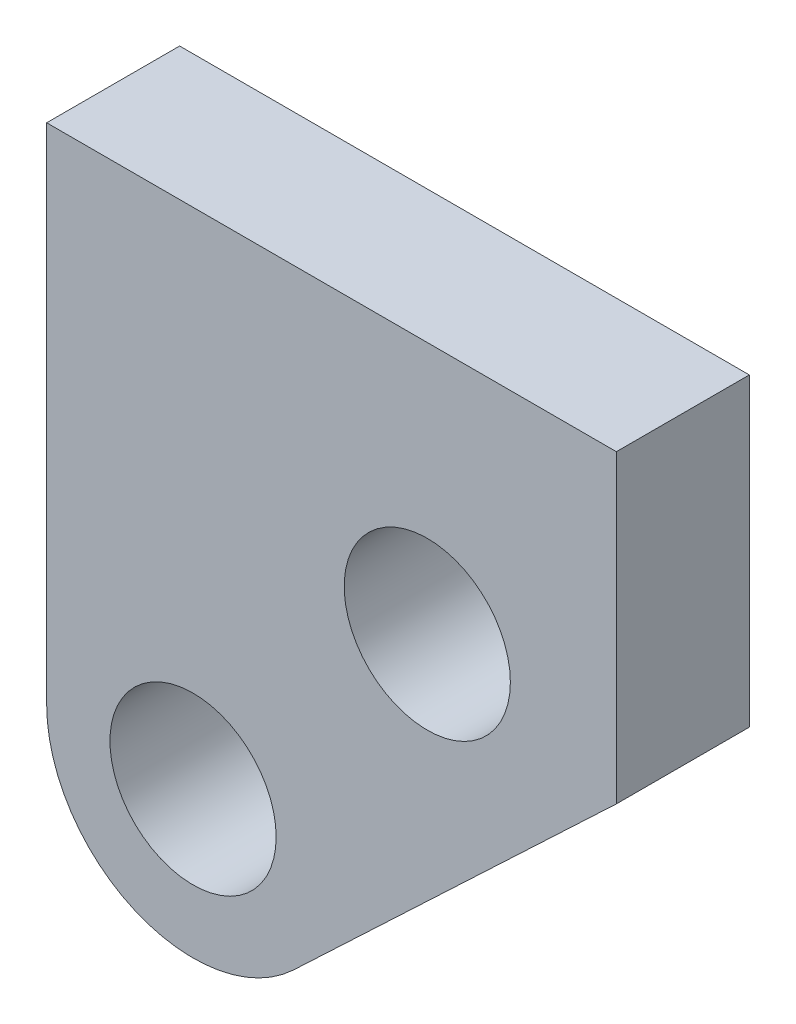
ISO-10303-21;
HEADER;
FILE_DESCRIPTION(('STEP AP214'),'2;1');
FILE_NAME('part.step','',(''),(''),'','','');
FILE_SCHEMA(('AUTOMOTIVE_DESIGN { 1 0 10303 214 1 1 1 1 }'));
ENDSEC;
DATA;
#1=APPLICATION_CONTEXT('core data for automotive mechanical design processes');
#2=APPLICATION_PROTOCOL_DEFINITION('international standard','automotive_design',2000,#1);
#3=PRODUCT_CONTEXT('',#1,'mechanical');
#4=PRODUCT('Part','Part','',(#3));
#5=PRODUCT_RELATED_PRODUCT_CATEGORY('part','',(#4));
#6=PRODUCT_DEFINITION_FORMATION('','',#4);
#7=PRODUCT_DEFINITION_CONTEXT('part definition',#1,'design');
#8=PRODUCT_DEFINITION('design','',#6,#7);
#9=PRODUCT_DEFINITION_SHAPE('','',#8);
#10=(LENGTH_UNIT() NAMED_UNIT(*) SI_UNIT(.MILLI.,.METRE.));
#11=(NAMED_UNIT(*) PLANE_ANGLE_UNIT() SI_UNIT($,.RADIAN.));
#12=(NAMED_UNIT(*) SI_UNIT($,.STERADIAN.) SOLID_ANGLE_UNIT());
#13=UNCERTAINTY_MEASURE_WITH_UNIT(LENGTH_MEASURE(1.E-05),#10,'distance_accuracy_value','');
#14=(GEOMETRIC_REPRESENTATION_CONTEXT(3) GLOBAL_UNCERTAINTY_ASSIGNED_CONTEXT((#13)) GLOBAL_UNIT_ASSIGNED_CONTEXT((#10,
#11,#12)) REPRESENTATION_CONTEXT('',''));
#15=CARTESIAN_POINT('',(0.,0.,0.));
#16=DIRECTION('',(0.,0.,1.));
#17=DIRECTION('',(1.,0.,0.));
#18=AXIS2_PLACEMENT_3D('',#15,#16,#17);
#19=CARTESIAN_POINT('',(54.0594805580869,22.7056662648686,-10.));
#20=DIRECTION('',(1.,0.,0.));
#21=DIRECTION('',(0.,0.,-1.));
#22=AXIS2_PLACEMENT_3D('',#19,#20,#21);
#23=PLANE('',#22);
#24=DIRECTION('',(0.,1.,0.));
#25=VECTOR('',#24,1.);
#26=CARTESIAN_POINT('',(54.0594805580869,22.7056662648686,0.));
#27=LINE('',#26,#25);
#28=CARTESIAN_POINT('',(54.0594805580869,-0.23891661839081,0.));
#29=VERTEX_POINT('',#28);
#30=CARTESIAN_POINT('',(54.0594805580869,22.7056662648686,0.));
#31=VERTEX_POINT('',#30);
#32=EDGE_CURVE('E114',#29,#31,#27,.T.);
#33=ORIENTED_EDGE('',*,*,#32,.F.);
#34=DIRECTION('',(0.,0.,1.));
#35=VECTOR('',#34,1.);
#36=CARTESIAN_POINT('',(54.0594805580869,-0.23891661839081,-10.));
#37=LINE('',#36,#35);
#38=CARTESIAN_POINT('',(54.0594805580869,-0.23891661839081,-10.));
#39=VERTEX_POINT('',#38);
#40=EDGE_CURVE('E11',#39,#29,#37,.T.);
#41=ORIENTED_EDGE('',*,*,#40,.F.);
#42=DIRECTION('',(0.,1.,0.));
#43=VECTOR('',#42,1.);
#44=CARTESIAN_POINT('',(54.0594805580869,22.7056662648686,-10.));
#45=LINE('',#44,#43);
#46=CARTESIAN_POINT('',(54.0594805580869,22.7056662648686,-10.));
#47=VERTEX_POINT('',#46);
#48=EDGE_CURVE('E109',#39,#47,#45,.T.);
#49=ORIENTED_EDGE('',*,*,#48,.T.);
#50=DIRECTION('',(0.,0.,1.));
#51=VECTOR('',#50,1.);
#52=CARTESIAN_POINT('',(54.0594805580869,22.7056662648686,-10.));
#53=LINE('',#52,#51);
#54=EDGE_CURVE('E40',#47,#31,#53,.T.);
#55=ORIENTED_EDGE('',*,*,#54,.T.);
#56=EDGE_LOOP('',(#33,#41,#49,#55));
#57=FACE_BOUND('',#56,.T.);
#58=ADVANCED_FACE('F37',(#57),#23,.T.);
#59=CARTESIAN_POINT('',(29.785193592599,-23.187206185045,-10.));
#60=DIRECTION('',(0.686980631745254,-0.726675726584349,0.));
#61=DIRECTION('',(0.726675726584349,0.686980631745254,0.));
#62=AXIS2_PLACEMENT_3D('',#59,#60,#61);
#63=PLANE('',#62);
#64=DIRECTION('',(0.726675726584349,0.686980631745254,0.));
#65=VECTOR('',#64,1.);
#66=CARTESIAN_POINT('',(29.785193592599,-23.187206185045,0.));
#67=LINE('',#66,#65);
#68=CARTESIAN_POINT('',(29.785193592599,-23.187206185045,0.));
#69=VERTEX_POINT('',#68);
#70=EDGE_CURVE('E124',#69,#29,#67,.T.);
#71=ORIENTED_EDGE('',*,*,#70,.F.);
#72=DIRECTION('',(0.,0.,1.));
#73=VECTOR('',#72,1.);
#74=CARTESIAN_POINT('',(29.785193592599,-23.187206185045,-10.));
#75=LINE('',#74,#73);
#76=CARTESIAN_POINT('',(29.785193592599,-23.187206185045,-10.));
#77=VERTEX_POINT('',#76);
#78=EDGE_CURVE('E46',#77,#69,#75,.T.);
#79=ORIENTED_EDGE('',*,*,#78,.F.);
#80=DIRECTION('',(0.726675726584349,0.686980631745254,0.));
#81=VECTOR('',#80,1.);
#82=CARTESIAN_POINT('',(29.785193592599,-23.187206185045,-10.));
#83=LINE('',#82,#81);
#84=EDGE_CURVE('E104',#77,#39,#83,.T.);
#85=ORIENTED_EDGE('',*,*,#84,.T.);
#86=ORIENTED_EDGE('',*,*,#40,.T.);
#87=EDGE_LOOP('',(#71,#79,#85,#86));
#88=FACE_BOUND('',#87,.T.);
#89=ADVANCED_FACE('F130',(#88),#63,.T.);
#90=CARTESIAN_POINT('',(22.2213904629931,-15.1863516034771,-10.));
#91=DIRECTION('',(0.,0.,1.));
#92=DIRECTION('',(1.,0.,0.));
#93=AXIS2_PLACEMENT_3D('',#90,#91,#92);
#94=CYLINDRICAL_SURFACE('',#93,11.01021306873);
#95=CARTESIAN_POINT('',(22.2213904629931,-15.1863516034771,0.));
#96=DIRECTION('',(0.,0.,1.));
#97=DIRECTION('',(1.,0.,0.));
#98=AXIS2_PLACEMENT_3D('',#95,#96,#97);
#99=CIRCLE('',#98,11.01021306873);
#100=CARTESIAN_POINT('',(11.2111773942631,-15.1863516034771,0.));
#101=VERTEX_POINT('',#100);
#102=EDGE_CURVE('E93',#101,#69,#99,.T.);
#103=ORIENTED_EDGE('',*,*,#102,.F.);
#104=DIRECTION('',(0.,0.,1.));
#105=VECTOR('',#104,1.);
#106=CARTESIAN_POINT('',(11.2111773942631,-15.1863516034771,-10.));
#107=LINE('',#106,#105);
#108=CARTESIAN_POINT('',(11.2111773942631,-15.1863516034771,-10.));
#109=VERTEX_POINT('',#108);
#110=EDGE_CURVE('E88',#109,#101,#107,.T.);
#111=ORIENTED_EDGE('',*,*,#110,.F.);
#112=CARTESIAN_POINT('',(22.2213904629931,-15.1863516034771,-10.));
#113=DIRECTION('',(0.,0.,1.));
#114=DIRECTION('',(1.,0.,0.));
#115=AXIS2_PLACEMENT_3D('',#112,#113,#114);
#116=CIRCLE('',#115,11.01021306873);
#117=EDGE_CURVE('E91',#109,#77,#116,.T.);
#118=ORIENTED_EDGE('',*,*,#117,.T.);
#119=ORIENTED_EDGE('',*,*,#78,.T.);
#120=EDGE_LOOP('',(#103,#111,#118,#119));
#121=FACE_BOUND('',#120,.T.);
#122=ADVANCED_FACE('F90',(#121),#94,.T.);
#123=CARTESIAN_POINT('',(11.2111773942631,22.7056662648686,-10.));
#124=DIRECTION('',(-1.,0.,0.));
#125=DIRECTION('',(0.,-1.,0.));
#126=AXIS2_PLACEMENT_3D('',#123,#124,#125);
#127=PLANE('',#126);
#128=DIRECTION('',(0.,-1.,0.));
#129=VECTOR('',#128,1.);
#130=CARTESIAN_POINT('',(11.2111773942631,22.7056662648686,0.));
#131=LINE('',#130,#129);
#132=CARTESIAN_POINT('',(11.2111773942631,22.7056662648686,0.));
#133=VERTEX_POINT('',#132);
#134=EDGE_CURVE('E121',#133,#101,#131,.T.);
#135=ORIENTED_EDGE('',*,*,#134,.F.);
#136=DIRECTION('',(0.,0.,1.));
#137=VECTOR('',#136,1.);
#138=CARTESIAN_POINT('',(11.2111773942631,22.7056662648686,-10.));
#139=LINE('',#138,#137);
#140=CARTESIAN_POINT('',(11.2111773942631,22.7056662648686,-10.));
#141=VERTEX_POINT('',#140);
#142=EDGE_CURVE('E98',#141,#133,#139,.T.);
#143=ORIENTED_EDGE('',*,*,#142,.F.);
#144=DIRECTION('',(0.,-1.,0.));
#145=VECTOR('',#144,1.);
#146=CARTESIAN_POINT('',(11.2111773942631,22.7056662648686,-10.));
#147=LINE('',#146,#145);
#148=EDGE_CURVE('E103',#141,#109,#147,.T.);
#149=ORIENTED_EDGE('',*,*,#148,.T.);
#150=ORIENTED_EDGE('',*,*,#110,.T.);
#151=EDGE_LOOP('',(#135,#143,#149,#150));
#152=FACE_BOUND('',#151,.T.);
#153=ADVANCED_FACE('F106',(#152),#127,.T.);
#154=CARTESIAN_POINT('',(54.0594805580869,22.7056662648686,-10.));
#155=DIRECTION('',(0.,1.,0.));
#156=DIRECTION('',(-1.,0.,0.));
#157=AXIS2_PLACEMENT_3D('',#154,#155,#156);
#158=PLANE('',#157);
#159=DIRECTION('',(-1.,0.,0.));
#160=VECTOR('',#159,1.);
#161=CARTESIAN_POINT('',(54.0594805580869,22.7056662648686,0.));
#162=LINE('',#161,#160);
#163=EDGE_CURVE('E117',#31,#133,#162,.T.);
#164=ORIENTED_EDGE('',*,*,#163,.F.);
#165=ORIENTED_EDGE('',*,*,#54,.F.);
#166=DIRECTION('',(-1.,0.,0.));
#167=VECTOR('',#166,1.);
#168=CARTESIAN_POINT('',(54.0594805580869,22.7056662648686,-10.));
#169=LINE('',#168,#167);
#170=EDGE_CURVE('E107',#47,#141,#169,.T.);
#171=ORIENTED_EDGE('',*,*,#170,.T.);
#172=ORIENTED_EDGE('',*,*,#142,.T.);
#173=EDGE_LOOP('',(#164,#165,#171,#172));
#174=FACE_BOUND('',#173,.T.);
#175=ADVANCED_FACE('F127',(#174),#158,.T.);
#176=CARTESIAN_POINT('',(22.2213904629931,-15.1863516034771,-10.));
#177=DIRECTION('',(0.,0.,1.));
#178=DIRECTION('',(1.,0.,0.));
#179=AXIS2_PLACEMENT_3D('',#176,#177,#178);
#180=PLANE('',#179);
#181=CARTESIAN_POINT('',(39.837339903571,3.70444137397563,-10.));
#182=DIRECTION('',(0.,0.,1.));
#183=DIRECTION('',(1.,0.,0.));
#184=AXIS2_PLACEMENT_3D('',#181,#182,#183);
#185=CIRCLE('',#184,6.25);
#186=CARTESIAN_POINT('',(46.087339903571,3.70444137397563,-10.));
#187=VERTEX_POINT('',#186);
#188=EDGE_CURVE('E165',#187,#187,#185,.T.);
#189=ORIENTED_EDGE('',*,*,#188,.T.);
#190=EDGE_LOOP('',(#189));
#191=FACE_BOUND('',#190,.T.);
#192=CARTESIAN_POINT('',(22.2213904629931,-15.1863516034771,-10.));
#193=DIRECTION('',(0.,0.,1.));
#194=DIRECTION('',(1.,0.,0.));
#195=AXIS2_PLACEMENT_3D('',#192,#193,#194);
#196=CIRCLE('',#195,6.25);
#197=CARTESIAN_POINT('',(28.4713904629931,-15.1863516034771,-10.));
#198=VERTEX_POINT('',#197);
#199=EDGE_CURVE('E118',#198,#198,#196,.T.);
#200=ORIENTED_EDGE('',*,*,#199,.T.);
#201=EDGE_LOOP('',(#200));
#202=FACE_BOUND('',#201,.T.);
#203=ORIENTED_EDGE('',*,*,#48,.F.);
#204=ORIENTED_EDGE('',*,*,#84,.F.);
#205=ORIENTED_EDGE('',*,*,#117,.F.);
#206=ORIENTED_EDGE('',*,*,#148,.F.);
#207=ORIENTED_EDGE('',*,*,#170,.F.);
#208=EDGE_LOOP('',(#203,#204,#205,#206,#207));
#209=FACE_BOUND('',#208,.T.);
#210=ADVANCED_FACE('F102',(#191,#202,#209),#180,.F.);
#211=CARTESIAN_POINT('',(22.2213904629931,-15.1863516034771,0.));
#212=DIRECTION('',(0.,0.,1.));
#213=DIRECTION('',(1.,0.,0.));
#214=AXIS2_PLACEMENT_3D('',#211,#212,#213);
#215=PLANE('',#214);
#216=CARTESIAN_POINT('',(39.837339903571,3.70444137397563,0.));
#217=DIRECTION('',(0.,0.,1.));
#218=DIRECTION('',(1.,0.,0.));
#219=AXIS2_PLACEMENT_3D('',#216,#217,#218);
#220=CIRCLE('',#219,6.25);
#221=CARTESIAN_POINT('',(46.087339903571,3.70444137397563,0.));
#222=VERTEX_POINT('',#221);
#223=EDGE_CURVE('E168',#222,#222,#220,.T.);
#224=ORIENTED_EDGE('',*,*,#223,.F.);
#225=EDGE_LOOP('',(#224));
#226=FACE_BOUND('',#225,.T.);
#227=CARTESIAN_POINT('',(22.2213904629931,-15.1863516034771,0.));
#228=DIRECTION('',(0.,0.,1.));
#229=DIRECTION('',(1.,0.,0.));
#230=AXIS2_PLACEMENT_3D('',#227,#228,#229);
#231=CIRCLE('',#230,6.25);
#232=CARTESIAN_POINT('',(28.4713904629931,-15.1863516034771,0.));
#233=VERTEX_POINT('',#232);
#234=EDGE_CURVE('E170',#233,#233,#231,.T.);
#235=ORIENTED_EDGE('',*,*,#234,.F.);
#236=EDGE_LOOP('',(#235));
#237=FACE_BOUND('',#236,.T.);
#238=ORIENTED_EDGE('',*,*,#32,.T.);
#239=ORIENTED_EDGE('',*,*,#163,.T.);
#240=ORIENTED_EDGE('',*,*,#134,.T.);
#241=ORIENTED_EDGE('',*,*,#102,.T.);
#242=ORIENTED_EDGE('',*,*,#70,.T.);
#243=EDGE_LOOP('',(#238,#239,#240,#241,#242));
#244=FACE_BOUND('',#243,.T.);
#245=ADVANCED_FACE('F129',(#226,#237,#244),#215,.T.);
#246=CARTESIAN_POINT('',(22.2213904629931,-15.1863516034771,-10.));
#247=DIRECTION('',(0.,0.,1.));
#248=DIRECTION('',(1.,0.,0.));
#249=AXIS2_PLACEMENT_3D('',#246,#247,#248);
#250=CYLINDRICAL_SURFACE('',#249,6.25);
#251=ORIENTED_EDGE('',*,*,#199,.F.);
#252=EDGE_LOOP('',(#251));
#253=FACE_BOUND('',#252,.T.);
#254=ORIENTED_EDGE('',*,*,#234,.T.);
#255=EDGE_LOOP('',(#254));
#256=FACE_BOUND('',#255,.T.);
#257=ADVANCED_FACE('F150',(#253,#256),#250,.F.);
#258=CARTESIAN_POINT('',(39.837339903571,3.70444137397563,-10.));
#259=DIRECTION('',(0.,0.,1.));
#260=DIRECTION('',(1.,0.,0.));
#261=AXIS2_PLACEMENT_3D('',#258,#259,#260);
#262=CYLINDRICAL_SURFACE('',#261,6.25);
#263=ORIENTED_EDGE('',*,*,#188,.F.);
#264=EDGE_LOOP('',(#263));
#265=FACE_BOUND('',#264,.T.);
#266=ORIENTED_EDGE('',*,*,#223,.T.);
#267=EDGE_LOOP('',(#266));
#268=FACE_BOUND('',#267,.T.);
#269=ADVANCED_FACE('F157',(#265,#268),#262,.F.);
#270=CLOSED_SHELL('',(#58,#89,#122,#153,#175,#210,#245,#257,#269));
#271=MANIFOLD_SOLID_BREP('B2',#270);
#272=ADVANCED_BREP_SHAPE_REPRESENTATION('',(#18,#271),#14);
#273=SHAPE_DEFINITION_REPRESENTATION(#9,#272);
ENDSEC;
END-ISO-10303-21;
